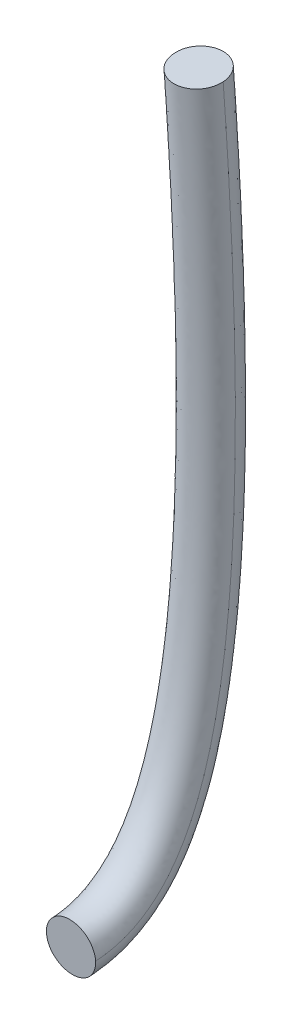
ISO-10303-21;
HEADER;
FILE_DESCRIPTION(('STEP AP214'),'2;1');
FILE_NAME('part.step','',(''),(''),'','','');
FILE_SCHEMA(('AUTOMOTIVE_DESIGN { 1 0 10303 214 1 1 1 1 }'));
ENDSEC;
DATA;
#1=APPLICATION_CONTEXT('core data for automotive mechanical design processes');
#2=APPLICATION_PROTOCOL_DEFINITION('international standard','automotive_design',2000,#1);
#3=PRODUCT_CONTEXT('',#1,'mechanical');
#4=PRODUCT('Part','Part','',(#3));
#5=PRODUCT_RELATED_PRODUCT_CATEGORY('part','',(#4));
#6=PRODUCT_DEFINITION_FORMATION('','',#4);
#7=PRODUCT_DEFINITION_CONTEXT('part definition',#1,'design');
#8=PRODUCT_DEFINITION('design','',#6,#7);
#9=PRODUCT_DEFINITION_SHAPE('','',#8);
#10=(LENGTH_UNIT() NAMED_UNIT(*) SI_UNIT(.MILLI.,.METRE.));
#11=(NAMED_UNIT(*) PLANE_ANGLE_UNIT() SI_UNIT($,.RADIAN.));
#12=(NAMED_UNIT(*) SI_UNIT($,.STERADIAN.) SOLID_ANGLE_UNIT());
#13=UNCERTAINTY_MEASURE_WITH_UNIT(LENGTH_MEASURE(1.E-05),#10,'distance_accuracy_value','');
#14=(GEOMETRIC_REPRESENTATION_CONTEXT(3) GLOBAL_UNCERTAINTY_ASSIGNED_CONTEXT((#13)) GLOBAL_UNIT_ASSIGNED_CONTEXT((#10,
#11,#12)) REPRESENTATION_CONTEXT('',''));
#15=CARTESIAN_POINT('',(0.,0.,0.));
#16=DIRECTION('',(0.,0.,1.));
#17=DIRECTION('',(1.,0.,0.));
#18=AXIS2_PLACEMENT_3D('',#15,#16,#17);
#19=CARTESIAN_POINT('',(11.655,-7.38568943191456,11.1672900449514));
#20=CARTESIAN_POINT('',(11.6549999999998,-7.37642950308164,10.9994364502612));
#21=CARTESIAN_POINT('',(11.6549999999996,-7.27630342783949,10.6948051044234));
#22=CARTESIAN_POINT('',(11.6549999999997,-6.87048917777656,10.3352007515177));
#23=CARTESIAN_POINT('',(11.6550000000001,-6.18721504391391,10.0812537883789));
#24=CARTESIAN_POINT('',(11.6550000000006,-5.06638115341206,9.90824073197935));
#25=CARTESIAN_POINT('',(11.6550000000009,-3.38098008594961,9.8645263128427));
#26=CARTESIAN_POINT('',(11.6550000000004,-1.83527381521949,9.93899557759439));
#27=CARTESIAN_POINT('',(11.655,-1.00000001490137,10.0000001490162));
#28=CARTESIAN_POINT('',(11.655000000001,-7.43610265920569,11.1645089135862));
#29=CARTESIAN_POINT('',(11.6550000000008,-7.42638032085317,10.9882732782254));
#30=CARTESIAN_POINT('',(11.6550000000006,-7.31962451098834,10.6638735561518));
#31=CARTESIAN_POINT('',(11.6550000000007,-6.8938951333657,10.2892025815977));
#32=CARTESIAN_POINT('',(11.6550000000011,-6.19822113593711,10.0317210509515));
#33=CARTESIAN_POINT('',(11.6550000000016,-5.06946376750325,9.85764584841629));
#34=CARTESIAN_POINT('',(11.6550000000019,-3.37989070994298,9.81403255172161));
#35=CARTESIAN_POINT('',(11.6550000000015,-1.83238214013707,9.88858240859414));
#36=CARTESIAN_POINT('',(11.655000000001,-0.996322261093759,9.94964439160444));
#37=CARTESIAN_POINT('',(11.6314657329663,-7.50310339202113,11.1608127042869));
#38=CARTESIAN_POINT('',(11.6314657329661,-7.49276693036642,10.9734449311186));
#39=CARTESIAN_POINT('',(11.6314657329659,-7.37719364942347,10.6227735553938));
#40=CARTESIAN_POINT('',(11.631465732966,-6.92500764401831,10.2280869718726));
#41=CARTESIAN_POINT('',(11.6314657329664,-6.21285509559761,9.96590082889384));
#42=CARTESIAN_POINT('',(11.6314657329669,-5.07356633024432,9.79041059094851));
#43=CARTESIAN_POINT('',(11.6314657329672,-3.37844806992609,9.74692825939269));
#44=CARTESIAN_POINT('',(11.6314657329668,-1.82853827840537,9.82158180703418));
#45=CARTESIAN_POINT('',(11.6314657329663,-0.99143441293436,9.88272003802996));
#46=CARTESIAN_POINT('',(11.5594827209695,-7.57470682203991,11.1568625793737));
#47=CARTESIAN_POINT('',(11.5594827209693,-7.56371461428945,10.9576081771217));
#48=CARTESIAN_POINT('',(11.5594827209691,-7.43870985180104,10.5788618555153));
#49=CARTESIAN_POINT('',(11.5594827209693,-6.95826434749167,10.1627956192212));
#50=CARTESIAN_POINT('',(11.5594827209697,-6.22850286445223,9.89557246014332));
#51=CARTESIAN_POINT('',(11.5594827209702,-5.07795812537405,9.71856552989048));
#52=CARTESIAN_POINT('',(11.5594827209704,-3.37691307638128,9.67521868586842));
#53=CARTESIAN_POINT('',(11.55948272097,-1.82442939714993,9.74997858745612));
#54=CARTESIAN_POINT('',(11.5594827209695,-0.986210788073624,9.81119823421743));
#55=CARTESIAN_POINT('',(11.4661651993567,-7.61993918790592,11.1543672590345));
#56=CARTESIAN_POINT('',(11.4661651993565,-7.60853190358489,10.9475888146755));
#57=CARTESIAN_POINT('',(11.4661651993563,-7.47758148450439,10.5511051821932));
#58=CARTESIAN_POINT('',(11.4661651993565,-6.97926263442873,10.1215170476304));
#59=CARTESIAN_POINT('',(11.4661651993569,-6.2383750536063,9.85112562485008));
#60=CARTESIAN_POINT('',(11.4661651993574,-5.08072148470491,9.67316718231176));
#61=CARTESIAN_POINT('',(11.4661651993576,-3.37593340886182,9.62991255626154));
#62=CARTESIAN_POINT('',(11.4661651993572,-1.82183521287128,9.70474625056067));
#63=CARTESIAN_POINT('',(11.4661651993567,-0.982910989296053,9.76601743217208));
#64=CARTESIAN_POINT('',(11.324949362033,-7.60399614520091,11.155246784082));
#65=CARTESIAN_POINT('',(11.3249493620328,-7.59273534393441,10.9511236200933));
#66=CARTESIAN_POINT('',(11.3249493620326,-7.4638779348113,10.5608923253414));
#67=CARTESIAN_POINT('',(11.3249493620327,-6.97186357748176,10.1360737612725));
#68=CARTESIAN_POINT('',(11.3249493620331,-6.2348981325642,9.8667961029654));
#69=CARTESIAN_POINT('',(11.3249493620336,-5.0797498558776,9.68917161401378));
#70=CARTESIAN_POINT('',(11.3249493620339,-3.3762808751905,9.64588305011632));
#71=CARTESIAN_POINT('',(11.3249493620335,-1.82274927660638,9.72068930553947));
#72=CARTESIAN_POINT('',(11.324949362033,-0.984074068693421,9.78194230018782));
#73=CARTESIAN_POINT('',(11.1980972115014,-7.47839137457077,11.1621759847302));
#74=CARTESIAN_POINT('',(11.1980972115013,-7.46828174135906,10.9789199029375));
#75=CARTESIAN_POINT('',(11.1980972115011,-7.35595593478696,10.6379391882091));
#76=CARTESIAN_POINT('',(11.1980972115012,-6.91353625014966,10.2506412061207));
#77=CARTESIAN_POINT('',(11.1980972115016,-6.20746244293162,9.99018505602275));
#78=CARTESIAN_POINT('',(11.1980972115021,-5.07205736580498,9.81521420852737));
#79=CARTESIAN_POINT('',(11.1980972115023,-3.37898398501736,9.77168103865558));
#80=CARTESIAN_POINT('',(11.1980972115019,-1.82995547365961,9.84629381581464));
#81=CARTESIAN_POINT('',(11.1980972115015,-0.993237207977785,9.9074038843685));
#82=CARTESIAN_POINT('',(11.1980059382297,-7.34852734403888,11.1693401546897));
#83=CARTESIAN_POINT('',(11.1980059382296,-7.33960818554163,11.0076636620943));
#84=CARTESIAN_POINT('',(11.1980059382294,-7.24437060325845,10.7176043195924));
#85=CARTESIAN_POINT('',(11.1980059382295,-6.85323433592736,10.3691044860337));
#86=CARTESIAN_POINT('',(11.1980059382299,-6.17910048289309,10.1177645707238));
#87=CARTESIAN_POINT('',(11.1980059382304,-5.06410756639803,9.94553521989886));
#88=CARTESIAN_POINT('',(11.1980059382306,-3.38178198864603,9.9017470076305));
#89=CARTESIAN_POINT('',(11.1980059382302,-1.83740557308382,9.9761576107514));
#90=CARTESIAN_POINT('',(11.1980059382298,-1.00271106947058,10.037119872996));
#91=CARTESIAN_POINT('',(11.2271047225965,-7.28816559997072,11.1726701128913));
#92=CARTESIAN_POINT('',(11.2271047225963,-7.2797996301063,11.0210212028225));
#93=CARTESIAN_POINT('',(11.2271047225961,-7.19250701599806,10.7546300864005));
#94=CARTESIAN_POINT('',(11.2271047225962,-6.82520370985346,10.4241609553937));
#95=CARTESIAN_POINT('',(11.2271047225966,-6.16591533893759,10.1770608211873));
#96=CARTESIAN_POINT('',(11.2271047225971,-5.06041044259915,10.0061069397303));
#97=CARTESIAN_POINT('',(11.2271047225974,-3.38308069767751,9.96220139050074));
#98=CARTESIAN_POINT('',(11.227104722597,-1.84086869288561,10.0365192263598));
#99=CARTESIAN_POINT('',(11.2271047225965,-1.00711458906273,10.0974128061124));
#100=B_SPLINE_SURFACE_WITH_KNOTS('',3,3,((#19,#20,#21,#22,#23,#24,#25,#26,#27),(#28,#29,#30,#31,
#32,#33,#34,#35,#36),(#37,#38,#39,#40,#41,#42,#43,#44,#45),(#46,#47,#48,#49,#50,#51,#52,#53,
#54),(#55,#56,#57,#58,#59,#60,#61,#62,#63),(#64,#65,#66,#67,#68,#69,#70,#71,#72),(#73,#74,#75,
#76,#77,#78,#79,#80,#81),(#82,#83,#84,#85,#86,#87,#88,#89,#90),(#91,#92,#93,#94,#95,#96,#97,#98,
#99)),.UNSPECIFIED.,.F.,.F.,.F.,(4,1,1,1,1,1,4),(4,1,1,1,1,1,4),(-3.14159265358979,
-2.46839422782055,-2.24399475256414,-1.79519580205131,-1.12199737628207,-0.448798950512828,
0.448798950512828),(0.,0.142857142857143,0.285714285714286,0.428571428571429,0.571428571428571,
0.785714285714286,1.),.UNSPECIFIED.);
#101=CARTESIAN_POINT('',(11.655,-7.38568943191456,11.1672900449514));
#102=CARTESIAN_POINT('',(11.6549999999998,-7.37642950308164,10.9994364502612));
#103=CARTESIAN_POINT('',(11.6549999999996,-7.27630342783949,10.6948051044234));
#104=CARTESIAN_POINT('',(11.6549999999997,-6.87048917777656,10.3352007515177));
#105=CARTESIAN_POINT('',(11.6550000000001,-6.18721504391391,10.0812537883789));
#106=CARTESIAN_POINT('',(11.6550000000006,-5.06638115341206,9.90824073197935));
#107=CARTESIAN_POINT('',(11.6550000000009,-3.38098008594961,9.8645263128427));
#108=CARTESIAN_POINT('',(11.6550000000004,-1.83527381521949,9.93899557759439));
#109=CARTESIAN_POINT('',(11.655,-1.00000001490137,10.0000001490162));
#110=B_SPLINE_CURVE_WITH_KNOTS('',3,(#101,#102,#103,#104,#105,#106,#107,#108,#109),
.UNSPECIFIED.,.F.,.F.,(4,1,1,1,1,1,4),(0.,0.142857142857143,0.285714285714286,0.428571428571429,
0.571428571428571,0.785714285714286,1.),.UNSPECIFIED.);
#111=CARTESIAN_POINT('',(11.655,-7.38568943191456,11.1672900449514));
#112=VERTEX_POINT('',#111);
#113=CARTESIAN_POINT('',(11.655,-1.00000001490137,10.0000001490162));
#114=VERTEX_POINT('',#113);
#115=EDGE_CURVE('E11',#112,#114,#110,.T.);
#116=CARTESIAN_POINT('',(11.655,-7.38568943191456,11.1672900449514));
#117=CARTESIAN_POINT('',(11.655021432269,-7.41102623071255,11.1658922973836));
#118=CARTESIAN_POINT('',(11.6505263832765,-7.43643558440554,11.1644905472017));
#119=CARTESIAN_POINT('',(11.6335799663967,-7.48438253121723,11.1618454723908));
#120=CARTESIAN_POINT('',(11.6211337942019,-7.5069219881546,11.1606020449411));
#121=CARTESIAN_POINT('',(11.5893168854476,-7.54640384613545,11.1584239611428));
#122=CARTESIAN_POINT('',(11.5699584779675,-7.56335610996156,11.157488760697));
#123=CARTESIAN_POINT('',(11.5269161834525,-7.58996051369478,11.1560210835486));
#124=CARTESIAN_POINT('',(11.5032610669717,-7.59965913606112,11.1554860425622));
#125=CARTESIAN_POINT('',(11.4539962800031,-7.61052245002709,11.1548867493841));
#126=CARTESIAN_POINT('',(11.428381567088,-7.6116643225653,11.1548237560449));
#127=CARTESIAN_POINT('',(11.378112210615,-7.6056409057274,11.1551560480721));
#128=CARTESIAN_POINT('',(11.3534591319864,-7.5984626153669,11.15555205066));
#129=CARTESIAN_POINT('',(11.3079969052311,-7.57620568167183,11.1567798922349));
#130=CARTESIAN_POINT('',(11.2871934505841,-7.56111546119564,11.1576123698946));
#131=CARTESIAN_POINT('',(11.2514946319189,-7.52495363452138,11.1596072985233));
#132=CARTESIAN_POINT('',(11.2366225756696,-7.50385897893951,11.1607710210507));
#133=CARTESIAN_POINT('',(11.215444519412,-7.45822866735702,11.1632882947418));
#134=CARTESIAN_POINT('',(11.2089698881395,-7.43377202590344,11.1646374869338));
#135=CARTESIAN_POINT('',(11.2052070842317,-7.39652581709678,11.1666922373459));
#136=CARTESIAN_POINT('',(11.204962769753,-7.38393241544284,11.1673869737518));
#137=CARTESIAN_POINT('',(11.2064978503065,-7.35885766942593,11.1687702647325));
#138=CARTESIAN_POINT('',(11.2082762252125,-7.34637627177329,11.1694588222472));
#139=CARTESIAN_POINT('',(11.213994520462,-7.32135713599309,11.1708390453947));
#140=CARTESIAN_POINT('',(11.218022201453,-7.30883910440542,11.1715296238827));
#141=CARTESIAN_POINT('',(11.228334191226,-7.28477026077042,11.172857422549));
#142=CARTESIAN_POINT('',(11.234617072197,-7.2732188424347,11.173494676174));
#143=CARTESIAN_POINT('',(11.2486123173746,-7.25220935097092,11.1746537004781));
#144=CARTESIAN_POINT('',(11.2561898549419,-7.24266056336166,11.1751804755756));
#145=CARTESIAN_POINT('',(11.2727549338634,-7.2248521023107,11.1761629095965));
#146=CARTESIAN_POINT('',(11.2817443693023,-7.21659419072975,11.1766184713238));
#147=CARTESIAN_POINT('',(11.3014949862749,-7.20109513594673,11.1774735030229));
#148=CARTESIAN_POINT('',(11.312331799179,-7.19394983688949,11.1778676855895));
#149=CARTESIAN_POINT('',(11.3350392911363,-7.18157667555211,11.1785502720639));
#150=CARTESIAN_POINT('',(11.3469084688056,-7.17634608453217,11.1788388265072));
#151=CARTESIAN_POINT('',(11.3713429972977,-7.16811609682303,11.1792928477668));
#152=CARTESIAN_POINT('',(11.3839046971399,-7.16510601438173,11.1794589040806));
#153=CARTESIAN_POINT('',(11.4093680793568,-7.16139890717877,11.17966341295));
#154=CARTESIAN_POINT('',(11.4222699709422,-7.16070334089124,11.1797017850463));
#155=CARTESIAN_POINT('',(11.4472866888863,-7.16145578060866,11.1796602754304));
#156=CARTESIAN_POINT('',(11.4594055864994,-7.16278737963842,11.1795868155069));
#157=CARTESIAN_POINT('',(11.4832964409691,-7.16730755754913,11.17933745221));
#158=CARTESIAN_POINT('',(11.4950682165302,-7.17049708935814,11.1791614962667));
#159=CARTESIAN_POINT('',(11.5188797464014,-7.1789929659636,11.1786928067943));
#160=CARTESIAN_POINT('',(11.5308675978026,-7.18444623258616,11.1783919680728));
#161=CARTESIAN_POINT('',(11.5536759073013,-7.19737043085767,11.1776789827094));
#162=CARTESIAN_POINT('',(11.5644980024574,-7.20483848008937,11.1772669950808));
#163=CARTESIAN_POINT('',(11.5935495624338,-7.22920182720459,11.1759229496294));
#164=CARTESIAN_POINT('',(11.6097629539359,-7.24856001205003,11.1748550224615));
#165=CARTESIAN_POINT('',(11.6353578513559,-7.29145214870155,11.1724888048442));
#166=CARTESIAN_POINT('',(11.6446965922135,-7.31501112530186,11.1711891338595));
#167=CARTESIAN_POINT('',(11.6532711774139,-7.35460493012099,11.1690048743236));
#168=CARTESIAN_POINT('',(11.6549868413216,-7.37013350609243,11.168148214038));
#169=CARTESIAN_POINT('',(11.655,-7.38568943191456,11.1672900449514));
#170=B_SPLINE_CURVE_WITH_KNOTS('',3,(#116,#117,#118,#119,#120,#121,#122,#123,#124,#125,#126,
#127,#128,#129,#130,#131,#132,#133,#134,#135,#136,#137,#138,#139,#140,#141,#142,#143,#144,#145,
#146,#147,#148,#149,#150,#151,#152,#153,#154,#155,#156,#157,#158,#159,#160,#161,#162,#163,#164,
#165,#166,#167,#168,#169),.UNSPECIFIED.,.T.,.F.,(4,2,2,2,2,2,2,2,2,2,2,2,2,2,2,2,2,2,2,2,2,2,2,
2,2,2,4),(0.,0.0759531363703712,0.151856691563085,0.22762553140344,0.302904571719567,
0.378384294282526,0.453982119717849,0.5296908737603,0.605694265772896,0.680146492721856,
0.717870631806929,0.755575753475097,0.794866603933561,0.834132622341086,0.870582709690234,
0.907082119806389,0.945863431555242,0.984589257067307,1.0231274843957,1.06168999169033,
1.09812009436689,1.13456889840487,1.17388811087658,1.21315136751742,1.28747929924168,
1.36226578251506,1.40889840429005),.UNSPECIFIED.);
#171=CARTESIAN_POINT('',(11.2271047225965,-7.28816559997072,11.1726701128913));
#172=VERTEX_POINT('',#171);
#173=EDGE_CURVE('E46',#112,#172,#170,.T.);
#174=CARTESIAN_POINT('',(11.2271047225965,-7.28816559997072,11.1726701128913));
#175=CARTESIAN_POINT('',(11.2271047225963,-7.2797996301063,11.0210212028225));
#176=CARTESIAN_POINT('',(11.2271047225961,-7.19250701599806,10.7546300864005));
#177=CARTESIAN_POINT('',(11.2271047225962,-6.82520370985346,10.4241609553937));
#178=CARTESIAN_POINT('',(11.2271047225966,-6.16591533893759,10.1770608211873));
#179=CARTESIAN_POINT('',(11.2271047225971,-5.06041044259915,10.0061069397303));
#180=CARTESIAN_POINT('',(11.2271047225974,-3.38308069767751,9.96220139050074));
#181=CARTESIAN_POINT('',(11.227104722597,-1.84086869288561,10.0365192263598));
#182=CARTESIAN_POINT('',(11.2271047225965,-1.00711458906273,10.0974128061124));
#183=B_SPLINE_CURVE_WITH_KNOTS('',3,(#174,#175,#176,#177,#178,#179,#180,#181,#182),
.UNSPECIFIED.,.F.,.F.,(4,1,1,1,1,1,4),(0.,0.142857142857143,0.285714285714286,0.428571428571429,
0.571428571428571,0.785714285714286,1.),.UNSPECIFIED.);
#184=CARTESIAN_POINT('',(11.2271047225965,-1.00711458906274,10.0974128061124));
#185=VERTEX_POINT('',#184);
#186=EDGE_CURVE('E28',#172,#185,#183,.T.);
#187=CARTESIAN_POINT('',(11.655,-1.00000001490137,10.0000001490162));
#188=CARTESIAN_POINT('',(11.6549890326016,-1.00092583839569,10.012676512287));
#189=CARTESIAN_POINT('',(11.6538470045168,-1.0018519431235,10.0253567262032));
#190=CARTESIAN_POINT('',(11.6494162505289,-1.00367804840967,10.050359736086));
#191=CARTESIAN_POINT('',(11.6461224252636,-1.00457798164143,10.0626816102178));
#192=CARTESIAN_POINT('',(11.6375784219414,-1.00632405806258,10.0865888659191));
#193=CARTESIAN_POINT('',(11.63233393671,-1.00717034947059,10.0981762768962));
#194=CARTESIAN_POINT('',(11.6200320665463,-1.00878910192883,10.1203402145496));
#195=CARTESIAN_POINT('',(11.6129759698224,-1.0095616149084,10.1309174522417));
#196=CARTESIAN_POINT('',(11.5969511121108,-1.01103223160026,10.1510531169041));
#197=CARTESIAN_POINT('',(11.5879315842057,-1.01172742901792,10.1605717509257));
#198=CARTESIAN_POINT('',(11.5682846019776,-1.01298393472151,10.1777758107149));
#199=CARTESIAN_POINT('',(11.5576582271393,-1.01354533224721,10.185462458352));
#200=CARTESIAN_POINT('',(11.535998709467,-1.01448708182569,10.1983568813605));
#201=CARTESIAN_POINT('',(11.5250455829032,-1.01487732764098,10.2037001219996));
#202=CARTESIAN_POINT('',(11.5024238048512,-1.01552864103271,10.2126178965075));
#203=CARTESIAN_POINT('',(11.4907541946947,-1.01578953110065,10.2161899999324));
#204=CARTESIAN_POINT('',(11.4662687484995,-1.01618853159879,10.2216531095754));
#205=CARTESIAN_POINT('',(11.4534265515684,-1.0163181072156,10.2234272572392));
#206=CARTESIAN_POINT('',(11.4276378755045,-1.016419032655,10.2248091270458));
#207=CARTESIAN_POINT('',(11.4146915691443,-1.01639060554655,10.2244199034456));
#208=CARTESIAN_POINT('',(11.3891147100837,-1.01616561617551,10.2213393518965));
#209=CARTESIAN_POINT('',(11.3764832155583,-1.01596963920882,10.2186560378116));
#210=CARTESIAN_POINT('',(11.3519122618763,-1.01541465909585,10.211057257306));
#211=CARTESIAN_POINT('',(11.3399732201858,-1.01505555873446,10.2061404598173));
#212=CARTESIAN_POINT('',(11.3177288005135,-1.01422100588033,10.1947137729675));
#213=CARTESIAN_POINT('',(11.3073696183935,-1.01375307251278,10.1883068353708));
#214=CARTESIAN_POINT('',(11.2877633417012,-1.01270600898163,10.1739704550888));
#215=CARTESIAN_POINT('',(11.2785168838424,-1.01212681564128,10.1660401473881));
#216=CARTESIAN_POINT('',(11.2606821878955,-1.01081997108093,10.1481468486251));
#217=CARTESIAN_POINT('',(11.2522056928845,-1.0100841524661,10.1380720296988));
#218=CARTESIAN_POINT('',(11.2371751866449,-1.00851686404928,10.1166127370326));
#219=CARTESIAN_POINT('',(11.2306183581385,-1.00768553693654,10.1052302169921));
#220=CARTESIAN_POINT('',(11.2148719121637,-1.00516514455278,10.0707210371778));
#221=CARTESIAN_POINT('',(11.2085761353575,-1.00337417919645,10.0461991627583));
#222=CARTESIAN_POINT('',(11.205125883206,-1.00065795466038,10.0090086516558));
#223=CARTESIAN_POINT('',(11.2049868769188,-0.999743693652443,9.99649060179851));
#224=CARTESIAN_POINT('',(11.2067076384381,-0.997924257992023,9.97157891234486));
#225=CARTESIAN_POINT('',(11.2085660975413,-0.997019077781929,9.95918519665377));
#226=CARTESIAN_POINT('',(11.2144336938249,-0.995200146553297,9.93428041387364));
#227=CARTESIAN_POINT('',(11.2185417818793,-0.994288069679736,9.9217922691559));
#228=CARTESIAN_POINT('',(11.228994570963,-0.992534412726049,9.89778122090137));
#229=CARTESIAN_POINT('',(11.2353389652298,-0.991692822996522,9.88625818524509));
#230=CARTESIAN_POINT('',(11.2494893455958,-0.99015740171299,9.86523521695454));
#231=CARTESIAN_POINT('',(11.2571727118138,-0.989457508103791,9.85565228273918));
#232=CARTESIAN_POINT('',(11.2739748903931,-0.988155758481148,9.83782874379745));
#233=CARTESIAN_POINT('',(11.2830942547151,-0.987553940347159,9.82958865771606));
#234=CARTESIAN_POINT('',(11.3029620298587,-0.986440134648832,9.81433844454733));
#235=CARTESIAN_POINT('',(11.3137639960526,-0.985933184659436,9.80739729187074));
#236=CARTESIAN_POINT('',(11.3364126475275,-0.985064216946941,9.79549939722705));
#237=CARTESIAN_POINT('',(11.3482589513418,-0.984702146568912,9.79054193430935));
#238=CARTESIAN_POINT('',(11.3723709714048,-0.984135803307572,9.78278756972406));
#239=CARTESIAN_POINT('',(11.3846232706799,-0.98392847297928,9.77994880555947));
#240=CARTESIAN_POINT('',(11.4094301243439,-0.983661554983372,9.77629416782318));
#241=CARTESIAN_POINT('',(11.4219847769378,-0.983602015990387,9.77547896070389));
#242=CARTESIAN_POINT('',(11.4473866036223,-0.983634281061705,9.77592073364189));
#243=CARTESIAN_POINT('',(11.4602330001756,-0.983730015331402,9.77723152602045));
#244=CARTESIAN_POINT('',(11.4854907719923,-0.984084902386194,9.78209063496987));
#245=CARTESIAN_POINT('',(11.4979022688135,-0.984344009116608,9.78563832096064));
#246=CARTESIAN_POINT('',(11.5215676734783,-0.985002563369619,9.79465523724771));
#247=CARTESIAN_POINT('',(11.5328451876697,-0.985397548892933,9.80006337390773));
#248=CARTESIAN_POINT('',(11.5543712934196,-0.986315685520701,9.81263448870165));
#249=CARTESIAN_POINT('',(11.5646196918338,-0.986838860620623,9.81979779538118));
#250=CARTESIAN_POINT('',(11.5840441852559,-0.98801665908617,9.8359241966886));
#251=CARTESIAN_POINT('',(11.5931858844947,-0.988674319604053,9.84492887596579));
#252=CARTESIAN_POINT('',(11.6097464150663,-0.990094647533293,9.86437598754306));
#253=CARTESIAN_POINT('',(11.6171653424394,-0.990857309087327,9.87481833964473));
#254=CARTESIAN_POINT('',(11.6362561505325,-0.993226743935524,9.90726061084083));
#255=CARTESIAN_POINT('',(11.6453359634724,-0.994950993313686,9.930869010953));
#256=CARTESIAN_POINT('',(11.6534374448655,-0.99780601029946,9.96995986647599));
#257=CARTESIAN_POINT('',(11.6550129975393,-0.998902815107237,9.98497730367214));
#258=CARTESIAN_POINT('',(11.655,-1.00000001490137,10.0000001490162));
#259=B_SPLINE_CURVE_WITH_KNOTS('',3,(#187,#188,#189,#190,#191,#192,#193,#194,#195,#196,#197,
#198,#199,#200,#201,#202,#203,#204,#205,#206,#207,#208,#209,#210,#211,#212,#213,#214,#215,#216,
#217,#218,#219,#220,#221,#222,#223,#224,#225,#226,#227,#228,#229,#230,#231,#232,#233,#234,#235,
#236,#237,#238,#239,#240,#241,#242,#243,#244,#245,#246,#247,#248,#249,#250,#251,#252,#253,#254,
#255,#256,#257,#258),.UNSPECIFIED.,.T.,.F.,(4,2,2,2,2,2,2,2,2,2,2,2,2,2,2,2,2,2,2,2,2,2,2,2,2,2,
2,2,2,2,2,2,2,2,2,4),(0.,0.038093012398399,0.0762766272859373,0.114349670097385,
0.152395714390902,0.191576439104144,0.230730958078193,0.267155564078833,0.303630016376649,
0.342346967815464,0.381009272388566,0.419537068589993,0.458087856022262,0.494510073011012,
0.530953033094851,0.57030986408208,0.609608642582234,0.684071207052358,0.721618143248386,
0.759140494355168,0.798463922425044,0.837781958449933,0.874530383319736,0.911292967978047,
0.949652437559383,0.987997953115561,1.02556415389988,1.06314272535866,1.10168739805098,
1.14022120985882,1.17759441555853,1.2149746224015,1.25331710389072,1.2916574473685,
1.36617370497556,1.41131799610421),.UNSPECIFIED.);
#260=EDGE_CURVE('E47',#185,#114,#259,.T.);
#261=ORIENTED_EDGE('',*,*,#115,.F.);
#262=ORIENTED_EDGE('',*,*,#173,.T.);
#263=ORIENTED_EDGE('',*,*,#186,.T.);
#264=ORIENTED_EDGE('',*,*,#260,.T.);
#265=EDGE_LOOP('',(#261,#262,#263,#264));
#266=FACE_BOUND('',#265,.T.);
#267=ADVANCED_FACE('F16',(#266),#100,.T.);
#268=CARTESIAN_POINT('',(11.43,-7.38568943191911,11.1672900449514));
#269=DIRECTION('',(-1.11249196396045E-12,0.0550829445172842,-0.998481782118886));
#270=DIRECTION('',(0.,0.998481782118886,0.0550829445172842));
#271=AXIS2_PLACEMENT_3D('',#268,#269,#270);
#272=PLANE('',#271);
#273=ORIENTED_EDGE('',*,*,#173,.F.);
#274=EDGE_CURVE('E49',#172,#112,#170,.T.);
#275=ORIENTED_EDGE('',*,*,#274,.F.);
#276=EDGE_LOOP('',(#273,#275));
#277=FACE_BOUND('',#276,.T.);
#278=ADVANCED_FACE('F53',(#277),#272,.F.);
#279=CARTESIAN_POINT('',(11.43,-1.00000001490116,10.0000001490116));
#280=DIRECTION('',(-5.32623886368089E-13,0.997343536648528,0.0728414024124084));
#281=DIRECTION('',(0.,-0.0728414024124084,0.997343536648528));
#282=AXIS2_PLACEMENT_3D('',#279,#280,#281);
#283=PLANE('',#282);
#284=EDGE_CURVE('E55',#114,#185,#259,.T.);
#285=ORIENTED_EDGE('',*,*,#284,.F.);
#286=ORIENTED_EDGE('',*,*,#260,.F.);
#287=EDGE_LOOP('',(#285,#286));
#288=FACE_BOUND('',#287,.T.);
#289=ADVANCED_FACE('F83',(#288),#283,.T.);
#290=CARTESIAN_POINT('',(11.2271047225965,-7.28816559997072,11.1726701128913));
#291=CARTESIAN_POINT('',(11.2271047225963,-7.2797996301063,11.0210212028225));
#292=CARTESIAN_POINT('',(11.2271047225961,-7.19250701599806,10.7546300864005));
#293=CARTESIAN_POINT('',(11.2271047225962,-6.82520370985346,10.4241609553937));
#294=CARTESIAN_POINT('',(11.2271047225966,-6.16591533893759,10.1770608211873));
#295=CARTESIAN_POINT('',(11.2271047225971,-5.06041044259915,10.0061069397303));
#296=CARTESIAN_POINT('',(11.2271047225974,-3.38308069767751,9.96220139050074));
#297=CARTESIAN_POINT('',(11.227104722597,-1.84086869288561,10.0365192263598));
#298=CARTESIAN_POINT('',(11.2271047225965,-1.00711458906273,10.0974128061124));
#299=CARTESIAN_POINT('',(11.2562035069632,-7.22780385590256,11.1760000710928));
#300=CARTESIAN_POINT('',(11.256203506963,-7.21999107467097,11.0343787435508));
#301=CARTESIAN_POINT('',(11.2562035069628,-7.14064342873767,10.7916558532085));
#302=CARTESIAN_POINT('',(11.2562035069629,-6.79717308377956,10.4792174247536));
#303=CARTESIAN_POINT('',(11.2562035069633,-6.15273019498208,10.2363570716509));
#304=CARTESIAN_POINT('',(11.2562035069638,-5.05671331880028,10.0666786595618));
#305=CARTESIAN_POINT('',(11.2562035069641,-3.38437940670898,10.022655773371));
#306=CARTESIAN_POINT('',(11.2562035069637,-1.8443318126874,10.0968808419683));
#307=CARTESIAN_POINT('',(11.2562035069632,-1.01151810865489,10.1577057392288));
#308=CARTESIAN_POINT('',(11.3727029567406,-7.13477291452351,11.181132281088));
#309=CARTESIAN_POINT('',(11.3727029567404,-7.12781234529244,11.054958895999));
#310=CARTESIAN_POINT('',(11.3727029567402,-7.06071517287156,10.8487130560024));
#311=CARTESIAN_POINT('',(11.3727029567403,-6.75396705288088,10.5640566965787));
#312=CARTESIAN_POINT('',(11.3727029567407,-6.13240328777552,10.3277369138469));
#313=CARTESIAN_POINT('',(11.3727029567412,-5.0510103086413,10.1600272401774));
#314=CARTESIAN_POINT('',(11.3727029567415,-3.38637652440211,10.1158264831663));
#315=CARTESIAN_POINT('',(11.3727029567411,-1.84966989255262,10.1899115387601));
#316=CARTESIAN_POINT('',(11.3727029567406,-1.01830491674602,10.2506306275485));
#317=CARTESIAN_POINT('',(11.5906118082348,-7.18477710458759,11.1783737149564));
#318=CARTESIAN_POINT('',(11.5906118082346,-7.17735919442599,11.0439101668904));
#319=CARTESIAN_POINT('',(11.5906118082344,-7.10366677946549,10.8180597726162));
#320=CARTESIAN_POINT('',(11.5906118082345,-6.7771991314078,10.5184845562689));
#321=CARTESIAN_POINT('',(11.5906118082349,-6.14333991037815,10.2786374154185));
#322=CARTESIAN_POINT('',(11.5906118082354,-5.05408515665866,10.109863847221));
#323=CARTESIAN_POINT('',(11.5906118082356,-3.38531171478457,10.0657529673706));
#324=CARTESIAN_POINT('',(11.5906118082352,-1.84679944120909,10.1399075699973));
#325=CARTESIAN_POINT('',(11.5906118082347,-1.01465700308739,10.2006834410712));
#326=CARTESIAN_POINT('',(11.6549999999986,-7.31847179552639,11.1709982201049));
#327=CARTESIAN_POINT('',(11.6549999999985,-7.30982729388697,11.0143003987002));
#328=CARTESIAN_POINT('',(11.6549999999982,-7.21855726356185,10.7360239754974));
#329=CARTESIAN_POINT('',(11.6549999999984,-6.83926761500373,10.3964867681539));
#330=CARTESIAN_POINT('',(11.6549999999988,-6.17252340455292,10.1472708038401));
#331=CARTESIAN_POINT('',(11.6549999999993,-5.06225634800456,9.97568275052048));
#332=CARTESIAN_POINT('',(11.6549999999995,-3.38241922364741,9.93184235939224));
#333=CARTESIAN_POINT('',(11.6549999999991,-1.83913128396928,10.00621299735));
#334=CARTESIAN_POINT('',(11.6549999999986,-1.00490368664486,10.0671411588984));
#335=CARTESIAN_POINT('',(11.655,-7.38568943191456,11.1672900449514));
#336=CARTESIAN_POINT('',(11.6549999999998,-7.37642950308164,10.9994364502612));
#337=CARTESIAN_POINT('',(11.6549999999996,-7.27630342783949,10.6948051044234));
#338=CARTESIAN_POINT('',(11.6549999999997,-6.87048917777656,10.3352007515177));
#339=CARTESIAN_POINT('',(11.6550000000001,-6.18721504391391,10.0812537883789));
#340=CARTESIAN_POINT('',(11.6550000000006,-5.06638115341206,9.90824073197935));
#341=CARTESIAN_POINT('',(11.6550000000009,-3.38098008594961,9.8645263128427));
#342=CARTESIAN_POINT('',(11.6550000000004,-1.83527381521949,9.93899557759439));
#343=CARTESIAN_POINT('',(11.655,-1.00000001490137,10.0000001490162));
#344=B_SPLINE_SURFACE_WITH_KNOTS('',3,3,((#290,#291,#292,#293,#294,#295,#296,#297,#298),(#299,
#300,#301,#302,#303,#304,#305,#306,#307),(#308,#309,#310,#311,#312,#313,#314,#315,#316),(#317,
#318,#319,#320,#321,#322,#323,#324,#325),(#326,#327,#328,#329,#330,#331,#332,#333,#334),(#335,
#336,#337,#338,#339,#340,#341,#342,#343)),.UNSPECIFIED.,.F.,.F.,.F.,(4,1,1,4),(4,1,1,1,1,1,4),
(0.448798950512828,1.34639685153848,2.24399475256414,3.14159265358979),(0.,0.142857142857143,
0.285714285714286,0.428571428571429,0.571428571428571,0.785714285714286,1.),.UNSPECIFIED.);
#345=ORIENTED_EDGE('',*,*,#274,.T.);
#346=ORIENTED_EDGE('',*,*,#115,.T.);
#347=ORIENTED_EDGE('',*,*,#284,.T.);
#348=ORIENTED_EDGE('',*,*,#186,.F.);
#349=EDGE_LOOP('',(#345,#346,#347,#348));
#350=FACE_BOUND('',#349,.T.);
#351=ADVANCED_FACE('F50',(#350),#344,.T.);
#352=CLOSED_SHELL('',(#267,#278,#289,#351));
#353=MANIFOLD_SOLID_BREP('B1',#352);
#354=ADVANCED_BREP_SHAPE_REPRESENTATION('',(#18,#353),#14);
#355=SHAPE_DEFINITION_REPRESENTATION(#9,#354);
ENDSEC;
END-ISO-10303-21;
